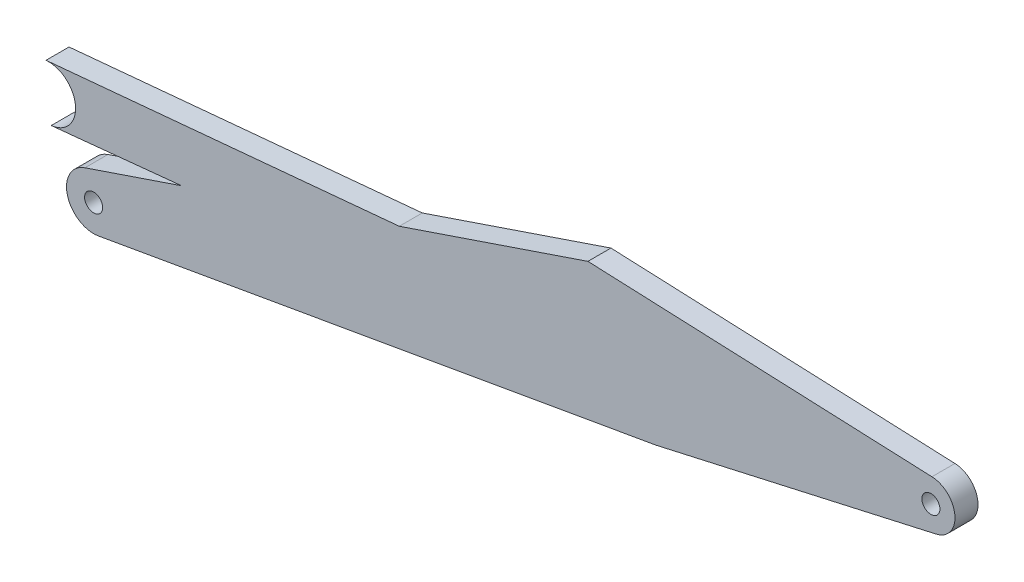
ISO-10303-21;
HEADER;
FILE_DESCRIPTION(('STEP AP214'),'2;1');
FILE_NAME('part.step','',(''),(''),'','','');
FILE_SCHEMA(('AUTOMOTIVE_DESIGN { 1 0 10303 214 1 1 1 1 }'));
ENDSEC;
DATA;
#1=APPLICATION_CONTEXT('core data for automotive mechanical design processes');
#2=APPLICATION_PROTOCOL_DEFINITION('international standard','automotive_design',2000,#1);
#3=PRODUCT_CONTEXT('',#1,'mechanical');
#4=PRODUCT('Part','Part','',(#3));
#5=PRODUCT_RELATED_PRODUCT_CATEGORY('part','',(#4));
#6=PRODUCT_DEFINITION_FORMATION('','',#4);
#7=PRODUCT_DEFINITION_CONTEXT('part definition',#1,'design');
#8=PRODUCT_DEFINITION('design','',#6,#7);
#9=PRODUCT_DEFINITION_SHAPE('','',#8);
#10=(LENGTH_UNIT() NAMED_UNIT(*) SI_UNIT(.MILLI.,.METRE.));
#11=(NAMED_UNIT(*) PLANE_ANGLE_UNIT() SI_UNIT($,.RADIAN.));
#12=(NAMED_UNIT(*) SI_UNIT($,.STERADIAN.) SOLID_ANGLE_UNIT());
#13=UNCERTAINTY_MEASURE_WITH_UNIT(LENGTH_MEASURE(1.E-05),#10,'distance_accuracy_value','');
#14=(GEOMETRIC_REPRESENTATION_CONTEXT(3) GLOBAL_UNCERTAINTY_ASSIGNED_CONTEXT((#13)) GLOBAL_UNIT_ASSIGNED_CONTEXT((#10,
#11,#12)) REPRESENTATION_CONTEXT('',''));
#15=CARTESIAN_POINT('',(0.,0.,0.));
#16=DIRECTION('',(0.,0.,1.));
#17=DIRECTION('',(1.,0.,0.));
#18=AXIS2_PLACEMENT_3D('',#15,#16,#17);
#19=CARTESIAN_POINT('',(-51.1200109094314,150.838496816133,6.35));
#20=DIRECTION('',(-0.320973485783683,0.94708818038442,0.));
#21=DIRECTION('',(-0.94708818038442,-0.320973485783683,0.));
#22=AXIS2_PLACEMENT_3D('',#19,#20,#21);
#23=PLANE('',#22);
#24=DIRECTION('',(0.94708818038442,0.320973485783683,0.));
#25=VECTOR('',#24,1.);
#26=CARTESIAN_POINT('',(-51.1200109094314,150.838496816133,0.));
#27=LINE('',#26,#25);
#28=CARTESIAN_POINT('',(-132.07794451347,123.401399944979,0.));
#29=VERTEX_POINT('',#28);
#30=CARTESIAN_POINT('',(-105.41946903293,132.436106509678,0.));
#31=VERTEX_POINT('',#30);
#32=EDGE_CURVE('E157',#29,#31,#27,.T.);
#33=ORIENTED_EDGE('',*,*,#32,.F.);
#34=DIRECTION('',(0.,0.,-1.));
#35=VECTOR('',#34,1.);
#36=CARTESIAN_POINT('',(-132.07794451347,123.401399944979,6.35));
#37=LINE('',#36,#35);
#38=CARTESIAN_POINT('',(-132.07794451347,123.401399944979,6.35));
#39=VERTEX_POINT('',#38);
#40=EDGE_CURVE('E11',#39,#29,#37,.T.);
#41=ORIENTED_EDGE('',*,*,#40,.F.);
#42=DIRECTION('',(0.94708818038442,0.320973485783683,0.));
#43=VECTOR('',#42,1.);
#44=CARTESIAN_POINT('',(-51.1200109094314,150.838496816133,6.35));
#45=LINE('',#44,#43);
#46=CARTESIAN_POINT('',(-105.41946903293,132.436106509678,6.35));
#47=VERTEX_POINT('',#46);
#48=EDGE_CURVE('E187',#39,#47,#45,.T.);
#49=ORIENTED_EDGE('',*,*,#48,.T.);
#50=DIRECTION('',(0.,0.,-1.));
#51=VECTOR('',#50,1.);
#52=CARTESIAN_POINT('',(-105.41946903293,132.436106509678,6.35));
#53=LINE('',#52,#51);
#54=EDGE_CURVE('E101',#47,#31,#53,.T.);
#55=ORIENTED_EDGE('',*,*,#54,.T.);
#56=EDGE_LOOP('',(#33,#41,#49,#55));
#57=FACE_BOUND('',#56,.T.);
#58=ADVANCED_FACE('F45',(#57),#23,.T.);
#59=CARTESIAN_POINT('',(-129.681042911032,116.32892424914,6.35));
#60=DIRECTION('',(0.,0.,-1.));
#61=DIRECTION('',(-1.,0.,0.));
#62=AXIS2_PLACEMENT_3D('',#59,#60,#61);
#63=CYLINDRICAL_SURFACE('',#62,7.4676);
#64=CARTESIAN_POINT('',(-129.681042911032,116.32892424914,0.));
#65=DIRECTION('',(0.,0.,1.));
#66=DIRECTION('',(1.,0.,0.));
#67=AXIS2_PLACEMENT_3D('',#64,#65,#66);
#68=CIRCLE('',#67,7.4676);
#69=CARTESIAN_POINT('',(-128.393349444225,108.973185313075,0.));
#70=VERTEX_POINT('',#69);
#71=EDGE_CURVE('E160',#29,#70,#68,.T.);
#72=ORIENTED_EDGE('',*,*,#71,.T.);
#73=DIRECTION('',(0.,0.,-1.));
#74=VECTOR('',#73,1.);
#75=CARTESIAN_POINT('',(-128.393349444225,108.973185313075,6.35));
#76=LINE('',#75,#74);
#77=CARTESIAN_POINT('',(-128.393349444225,108.973185313075,6.35));
#78=VERTEX_POINT('',#77);
#79=EDGE_CURVE('E53',#78,#70,#76,.T.);
#80=ORIENTED_EDGE('',*,*,#79,.F.);
#81=CARTESIAN_POINT('',(-129.681042911032,116.32892424914,6.35));
#82=DIRECTION('',(0.,0.,1.));
#83=DIRECTION('',(1.,0.,0.));
#84=AXIS2_PLACEMENT_3D('',#81,#82,#83);
#85=CIRCLE('',#84,7.4676);
#86=EDGE_CURVE('E225',#39,#78,#85,.T.);
#87=ORIENTED_EDGE('',*,*,#86,.F.);
#88=ORIENTED_EDGE('',*,*,#40,.T.);
#89=EDGE_LOOP('',(#72,#80,#87,#88));
#90=FACE_BOUND('',#89,.T.);
#91=ADVANCED_FACE('F235',(#90),#63,.T.);
#92=CARTESIAN_POINT('',(-22.3273027427624,127.541075850596,6.35));
#93=DIRECTION('',(-0.172437391773292,0.985020479948729,0.));
#94=DIRECTION('',(-0.985020479948729,-0.172437391773292,0.));
#95=AXIS2_PLACEMENT_3D('',#92,#93,#94);
#96=PLANE('',#95);
#97=DIRECTION('',(0.985020479948729,0.172437391773292,0.));
#98=VECTOR('',#97,1.);
#99=CARTESIAN_POINT('',(-22.3273027427624,127.541075850596,0.));
#100=LINE('',#99,#98);
#101=CARTESIAN_POINT('',(25.5217350516949,135.917514152232,0.));
#102=VERTEX_POINT('',#101);
#103=EDGE_CURVE('E162',#70,#102,#100,.T.);
#104=ORIENTED_EDGE('',*,*,#103,.T.);
#105=DIRECTION('',(0.,0.,-1.));
#106=VECTOR('',#105,1.);
#107=CARTESIAN_POINT('',(25.5217350516949,135.917514152232,6.35));
#108=LINE('',#107,#106);
#109=CARTESIAN_POINT('',(25.5217350516949,135.917514152232,6.35));
#110=VERTEX_POINT('',#109);
#111=EDGE_CURVE('E198',#110,#102,#108,.T.);
#112=ORIENTED_EDGE('',*,*,#111,.F.);
#113=DIRECTION('',(0.985020479948729,0.172437391773292,0.));
#114=VECTOR('',#113,1.);
#115=CARTESIAN_POINT('',(-22.3273027427624,127.541075850596,6.35));
#116=LINE('',#115,#114);
#117=EDGE_CURVE('E206',#78,#110,#116,.T.);
#118=ORIENTED_EDGE('',*,*,#117,.F.);
#119=ORIENTED_EDGE('',*,*,#79,.T.);
#120=EDGE_LOOP('',(#104,#112,#118,#119));
#121=FACE_BOUND('',#120,.T.);
#122=ADVANCED_FACE('F204',(#121),#96,.F.);
#123=CARTESIAN_POINT('',(-27.8957955703113,123.889680090386,6.35));
#124=DIRECTION('',(0.219666723094275,-0.975574974445851,0.));
#125=DIRECTION('',(0.975574974445851,0.219666723094275,0.));
#126=AXIS2_PLACEMENT_3D('',#123,#124,#125);
#127=PLANE('',#126);
#128=DIRECTION('',(-0.975574974445851,-0.219666723094275,0.));
#129=VECTOR('',#128,1.);
#130=CARTESIAN_POINT('',(-27.8957955703113,123.889680090386,0.));
#131=LINE('',#130,#129);
#132=CARTESIAN_POINT('',(102.676887006842,153.290263396292,0.));
#133=VERTEX_POINT('',#132);
#134=EDGE_CURVE('E165',#133,#102,#131,.T.);
#135=ORIENTED_EDGE('',*,*,#134,.F.);
#136=DIRECTION('',(0.,0.,-1.));
#137=VECTOR('',#136,1.);
#138=CARTESIAN_POINT('',(102.676887006842,153.290263396292,6.35));
#139=LINE('',#138,#137);
#140=CARTESIAN_POINT('',(102.676887006842,153.290263396292,6.35));
#141=VERTEX_POINT('',#140);
#142=EDGE_CURVE('E196',#141,#133,#139,.T.);
#143=ORIENTED_EDGE('',*,*,#142,.F.);
#144=DIRECTION('',(-0.975574974445851,-0.219666723094275,0.));
#145=VECTOR('',#144,1.);
#146=CARTESIAN_POINT('',(-27.8957955703113,123.889680090386,6.35));
#147=LINE('',#146,#145);
#148=EDGE_CURVE('E220',#141,#110,#147,.T.);
#149=ORIENTED_EDGE('',*,*,#148,.T.);
#150=ORIENTED_EDGE('',*,*,#111,.T.);
#151=EDGE_LOOP('',(#135,#143,#149,#150));
#152=FACE_BOUND('',#151,.T.);
#153=ADVANCED_FACE('F216',(#152),#127,.T.);
#154=CARTESIAN_POINT('',(101.218768587839,159.766,6.35));
#155=DIRECTION('',(0.,0.,-1.));
#156=DIRECTION('',(-1.,0.,0.));
#157=AXIS2_PLACEMENT_3D('',#154,#155,#156);
#158=CYLINDRICAL_SURFACE('',#157,6.63786666666665);
#159=CARTESIAN_POINT('',(101.218768587839,159.766,0.));
#160=DIRECTION('',(0.,0.,1.));
#161=DIRECTION('',(1.,0.,0.));
#162=AXIS2_PLACEMENT_3D('',#159,#160,#161);
#163=CIRCLE('',#162,6.63786666666665);
#164=CARTESIAN_POINT('',(101.499276887097,166.397937045727,0.));
#165=VERTEX_POINT('',#164);
#166=EDGE_CURVE('E168',#133,#165,#163,.T.);
#167=ORIENTED_EDGE('',*,*,#166,.T.);
#168=DIRECTION('',(0.,0.,-1.));
#169=VECTOR('',#168,1.);
#170=CARTESIAN_POINT('',(101.499276887097,166.397937045727,6.35));
#171=LINE('',#170,#169);
#172=CARTESIAN_POINT('',(101.499276887097,166.397937045727,6.35));
#173=VERTEX_POINT('',#172);
#174=EDGE_CURVE('E193',#173,#165,#171,.T.);
#175=ORIENTED_EDGE('',*,*,#174,.F.);
#176=CARTESIAN_POINT('',(101.218768587839,159.766,6.35));
#177=DIRECTION('',(0.,0.,1.));
#178=DIRECTION('',(1.,0.,0.));
#179=AXIS2_PLACEMENT_3D('',#176,#177,#178);
#180=CIRCLE('',#179,6.63786666666665);
#181=EDGE_CURVE('E221',#141,#173,#180,.T.);
#182=ORIENTED_EDGE('',*,*,#181,.F.);
#183=ORIENTED_EDGE('',*,*,#142,.T.);
#184=EDGE_LOOP('',(#167,#175,#182,#183));
#185=FACE_BOUND('',#184,.T.);
#186=ADVANCED_FACE('F245',(#185),#158,.T.);
#187=CARTESIAN_POINT('',(7.20675418569532,170.38618889332,6.35));
#188=DIRECTION('',(-0.0422588029173437,-0.999106697793581,0.));
#189=DIRECTION('',(0.999106697793581,-0.0422588029173437,0.));
#190=AXIS2_PLACEMENT_3D('',#187,#188,#189);
#191=PLANE('',#190);
#192=DIRECTION('',(-0.999106697793581,0.0422588029173437,0.));
#193=VECTOR('',#192,1.);
#194=CARTESIAN_POINT('',(7.20675418569532,170.38618889332,0.));
#195=LINE('',#194,#193);
#196=CARTESIAN_POINT('',(6.63074724122809,170.410552020901,0.));
#197=VERTEX_POINT('',#196);
#198=EDGE_CURVE('E170',#165,#197,#195,.T.);
#199=ORIENTED_EDGE('',*,*,#198,.T.);
#200=DIRECTION('',(0.,0.,-1.));
#201=VECTOR('',#200,1.);
#202=CARTESIAN_POINT('',(6.63074724122809,170.410552020901,6.35));
#203=LINE('',#202,#201);
#204=CARTESIAN_POINT('',(6.63074724122809,170.410552020901,6.35));
#205=VERTEX_POINT('',#204);
#206=EDGE_CURVE('E191',#205,#197,#203,.T.);
#207=ORIENTED_EDGE('',*,*,#206,.F.);
#208=DIRECTION('',(-0.999106697793581,0.0422588029173437,0.));
#209=VECTOR('',#208,1.);
#210=CARTESIAN_POINT('',(7.20675418569532,170.38618889332,6.35));
#211=LINE('',#210,#209);
#212=EDGE_CURVE('E223',#173,#205,#211,.T.);
#213=ORIENTED_EDGE('',*,*,#212,.F.);
#214=ORIENTED_EDGE('',*,*,#174,.T.);
#215=EDGE_LOOP('',(#199,#207,#213,#214));
#216=FACE_BOUND('',#215,.T.);
#217=ADVANCED_FACE('F248',(#216),#191,.F.);
#218=CARTESIAN_POINT('',(-51.1200109094314,150.838496816133,6.35));
#219=DIRECTION('',(-0.320973485783683,0.94708818038442,0.));
#220=DIRECTION('',(-0.94708818038442,-0.320973485783683,0.));
#221=AXIS2_PLACEMENT_3D('',#218,#219,#220);
#222=PLANE('',#221);
#223=DIRECTION('',(0.94708818038442,0.320973485783683,0.));
#224=VECTOR('',#223,1.);
#225=CARTESIAN_POINT('',(-51.1200109094314,150.838496816133,0.));
#226=LINE('',#225,#224);
#227=CARTESIAN_POINT('',(-45.3931629655145,152.779357641115,0.));
#228=VERTEX_POINT('',#227);
#229=EDGE_CURVE('E173',#228,#197,#226,.T.);
#230=ORIENTED_EDGE('',*,*,#229,.F.);
#231=DIRECTION('',(0.,0.,-1.));
#232=VECTOR('',#231,1.);
#233=CARTESIAN_POINT('',(-45.3931629655145,152.779357641115,6.35));
#234=LINE('',#233,#232);
#235=CARTESIAN_POINT('',(-45.3931629655145,152.779357641115,6.35));
#236=VERTEX_POINT('',#235);
#237=EDGE_CURVE('E137',#236,#228,#234,.T.);
#238=ORIENTED_EDGE('',*,*,#237,.F.);
#239=DIRECTION('',(0.94708818038442,0.320973485783683,0.));
#240=VECTOR('',#239,1.);
#241=CARTESIAN_POINT('',(-51.1200109094314,150.838496816133,6.35));
#242=LINE('',#241,#240);
#243=EDGE_CURVE('E144',#236,#205,#242,.T.);
#244=ORIENTED_EDGE('',*,*,#243,.T.);
#245=ORIENTED_EDGE('',*,*,#206,.T.);
#246=EDGE_LOOP('',(#230,#238,#244,#245));
#247=FACE_BOUND('',#246,.T.);
#248=ADVANCED_FACE('F231',(#247),#222,.T.);
#249=CARTESIAN_POINT('',(-14.4955230944036,155.65669896527,6.35));
#250=DIRECTION('',(-0.0927237608336719,0.995691872105452,0.));
#251=DIRECTION('',(-0.995691872105452,-0.0927237608336719,0.));
#252=AXIS2_PLACEMENT_3D('',#249,#250,#251);
#253=PLANE('',#252);
#254=DIRECTION('',(0.995691872105452,0.0927237608336719,0.));
#255=VECTOR('',#254,1.);
#256=CARTESIAN_POINT('',(-14.4955230944036,155.65669896527,0.));
#257=LINE('',#256,#255);
#258=CARTESIAN_POINT('',(-142.81014739499,143.707405344994,0.));
#259=VERTEX_POINT('',#258);
#260=EDGE_CURVE('E132',#259,#228,#257,.T.);
#261=ORIENTED_EDGE('',*,*,#260,.F.);
#262=DIRECTION('',(0.,0.,-1.));
#263=VECTOR('',#262,1.);
#264=CARTESIAN_POINT('',(-142.81014739499,143.707405344994,6.35));
#265=LINE('',#264,#263);
#266=CARTESIAN_POINT('',(-142.81014739499,143.707405344994,6.35));
#267=VERTEX_POINT('',#266);
#268=EDGE_CURVE('E127',#267,#259,#265,.T.);
#269=ORIENTED_EDGE('',*,*,#268,.F.);
#270=DIRECTION('',(0.995691872105452,0.0927237608336719,0.));
#271=VECTOR('',#270,1.);
#272=CARTESIAN_POINT('',(-14.4955230944036,155.65669896527,6.35));
#273=LINE('',#272,#271);
#274=EDGE_CURVE('E130',#267,#236,#273,.T.);
#275=ORIENTED_EDGE('',*,*,#274,.T.);
#276=ORIENTED_EDGE('',*,*,#237,.T.);
#277=EDGE_LOOP('',(#261,#269,#275,#276));
#278=FACE_BOUND('',#277,.T.);
#279=ADVANCED_FACE('F129',(#278),#253,.T.);
#280=CARTESIAN_POINT('',(-142.117723438589,136.271976720859,6.35));
#281=DIRECTION('',(0.,0.,-1.));
#282=DIRECTION('',(-1.,0.,0.));
#283=AXIS2_PLACEMENT_3D('',#280,#281,#282);
#284=CYLINDRICAL_SURFACE('',#283,7.46759999999998);
#285=CARTESIAN_POINT('',(-142.117723438589,136.271976720859,0.));
#286=DIRECTION('',(0.,0.,1.));
#287=DIRECTION('',(1.,0.,0.));
#288=AXIS2_PLACEMENT_3D('',#285,#286,#287);
#289=CIRCLE('',#288,7.46759999999998);
#290=CARTESIAN_POINT('',(-141.374843498332,128.841419598115,0.));
#291=VERTEX_POINT('',#290);
#292=EDGE_CURVE('E177',#291,#259,#289,.T.);
#293=ORIENTED_EDGE('',*,*,#292,.F.);
#294=DIRECTION('',(0.,0.,-1.));
#295=VECTOR('',#294,1.);
#296=CARTESIAN_POINT('',(-141.374843498332,128.841419598115,6.35));
#297=LINE('',#296,#295);
#298=CARTESIAN_POINT('',(-141.374843498332,128.841419598115,6.35));
#299=VERTEX_POINT('',#298);
#300=EDGE_CURVE('E94',#299,#291,#297,.T.);
#301=ORIENTED_EDGE('',*,*,#300,.F.);
#302=CARTESIAN_POINT('',(-142.117723438589,136.271976720859,6.35));
#303=DIRECTION('',(0.,0.,1.));
#304=DIRECTION('',(1.,0.,0.));
#305=AXIS2_PLACEMENT_3D('',#302,#303,#304);
#306=CIRCLE('',#305,7.46759999999998);
#307=EDGE_CURVE('E142',#299,#267,#306,.T.);
#308=ORIENTED_EDGE('',*,*,#307,.T.);
#309=ORIENTED_EDGE('',*,*,#268,.T.);
#310=EDGE_LOOP('',(#293,#301,#308,#309));
#311=FACE_BOUND('',#310,.T.);
#312=ADVANCED_FACE('F146',(#311),#284,.F.);
#313=CARTESIAN_POINT('',(101.218768587839,159.766,6.35));
#314=DIRECTION('',(0.,0.,-1.));
#315=DIRECTION('',(-1.,0.,0.));
#316=AXIS2_PLACEMENT_3D('',#313,#314,#315);
#317=CYLINDRICAL_SURFACE('',#316,2.48920000000001);
#318=CARTESIAN_POINT('',(101.218768587839,159.766,6.35));
#319=DIRECTION('',(0.,0.,1.));
#320=DIRECTION('',(1.,0.,0.));
#321=AXIS2_PLACEMENT_3D('',#318,#319,#320);
#322=CIRCLE('',#321,2.48920000000001);
#323=CARTESIAN_POINT('',(103.707968587839,159.766,6.35));
#324=VERTEX_POINT('',#323);
#325=EDGE_CURVE('E148',#324,#324,#322,.T.);
#326=ORIENTED_EDGE('',*,*,#325,.T.);
#327=EDGE_LOOP('',(#326));
#328=FACE_BOUND('',#327,.T.);
#329=CARTESIAN_POINT('',(101.218768587839,159.766,0.));
#330=DIRECTION('',(0.,0.,1.));
#331=DIRECTION('',(1.,0.,0.));
#332=AXIS2_PLACEMENT_3D('',#329,#330,#331);
#333=CIRCLE('',#332,2.48920000000001);
#334=CARTESIAN_POINT('',(103.707968587839,159.766,0.));
#335=VERTEX_POINT('',#334);
#336=EDGE_CURVE('E181',#335,#335,#333,.T.);
#337=ORIENTED_EDGE('',*,*,#336,.F.);
#338=EDGE_LOOP('',(#337));
#339=FACE_BOUND('',#338,.T.);
#340=ADVANCED_FACE('F259',(#328,#339),#317,.F.);
#341=CARTESIAN_POINT('',(-14.1527136523222,141.560623105747,6.35));
#342=DIRECTION('',(-0.0994804140896887,0.995039520427477,0.));
#343=DIRECTION('',(-0.995039520427477,-0.0994804140896888,0.));
#344=AXIS2_PLACEMENT_3D('',#341,#342,#343);
#345=PLANE('',#344);
#346=DIRECTION('',(0.995039520427477,0.0994804140896887,0.));
#347=VECTOR('',#346,1.);
#348=CARTESIAN_POINT('',(-14.1527136523222,141.560623105747,0.));
#349=LINE('',#348,#347);
#350=EDGE_CURVE('E179',#291,#31,#349,.T.);
#351=ORIENTED_EDGE('',*,*,#350,.T.);
#352=ORIENTED_EDGE('',*,*,#54,.F.);
#353=DIRECTION('',(0.995039520427477,0.0994804140896887,0.));
#354=VECTOR('',#353,1.);
#355=CARTESIAN_POINT('',(-14.1527136523222,141.560623105747,6.35));
#356=LINE('',#355,#354);
#357=EDGE_CURVE('E61',#299,#47,#356,.T.);
#358=ORIENTED_EDGE('',*,*,#357,.F.);
#359=ORIENTED_EDGE('',*,*,#300,.T.);
#360=EDGE_LOOP('',(#351,#352,#358,#359));
#361=FACE_BOUND('',#360,.T.);
#362=ADVANCED_FACE('F233',(#361),#345,.F.);
#363=CARTESIAN_POINT('',(-129.681042911032,116.32892424914,6.35));
#364=DIRECTION('',(0.,0.,-1.));
#365=DIRECTION('',(-1.,0.,0.));
#366=AXIS2_PLACEMENT_3D('',#363,#364,#365);
#367=CYLINDRICAL_SURFACE('',#366,2.4892);
#368=CARTESIAN_POINT('',(-129.681042911032,116.32892424914,6.35));
#369=DIRECTION('',(0.,0.,1.));
#370=DIRECTION('',(1.,0.,0.));
#371=AXIS2_PLACEMENT_3D('',#368,#369,#370);
#372=CIRCLE('',#371,2.4892);
#373=CARTESIAN_POINT('',(-127.191842911032,116.32892424914,6.35));
#374=VERTEX_POINT('',#373);
#375=EDGE_CURVE('E154',#374,#374,#372,.T.);
#376=ORIENTED_EDGE('',*,*,#375,.T.);
#377=EDGE_LOOP('',(#376));
#378=FACE_BOUND('',#377,.T.);
#379=CARTESIAN_POINT('',(-129.681042911032,116.32892424914,0.));
#380=DIRECTION('',(0.,0.,1.));
#381=DIRECTION('',(1.,0.,0.));
#382=AXIS2_PLACEMENT_3D('',#379,#380,#381);
#383=CIRCLE('',#382,2.4892);
#384=CARTESIAN_POINT('',(-127.191842911032,116.32892424914,0.));
#385=VERTEX_POINT('',#384);
#386=EDGE_CURVE('E184',#385,#385,#383,.T.);
#387=ORIENTED_EDGE('',*,*,#386,.F.);
#388=EDGE_LOOP('',(#387));
#389=FACE_BOUND('',#388,.T.);
#390=ADVANCED_FACE('F262',(#378,#389),#367,.F.);
#391=CARTESIAN_POINT('',(0.,0.,6.35));
#392=DIRECTION('',(0.,0.,1.));
#393=DIRECTION('',(1.,0.,0.));
#394=AXIS2_PLACEMENT_3D('',#391,#392,#393);
#395=PLANE('',#394);
#396=ORIENTED_EDGE('',*,*,#48,.F.);
#397=ORIENTED_EDGE('',*,*,#86,.T.);
#398=ORIENTED_EDGE('',*,*,#117,.T.);
#399=ORIENTED_EDGE('',*,*,#148,.F.);
#400=ORIENTED_EDGE('',*,*,#181,.T.);
#401=ORIENTED_EDGE('',*,*,#212,.T.);
#402=ORIENTED_EDGE('',*,*,#243,.F.);
#403=ORIENTED_EDGE('',*,*,#274,.F.);
#404=ORIENTED_EDGE('',*,*,#307,.F.);
#405=ORIENTED_EDGE('',*,*,#357,.T.);
#406=EDGE_LOOP('',(#396,#397,#398,#399,#400,#401,#402,#403,#404,#405));
#407=FACE_BOUND('',#406,.T.);
#408=ORIENTED_EDGE('',*,*,#325,.F.);
#409=EDGE_LOOP('',(#408));
#410=FACE_BOUND('',#409,.T.);
#411=ORIENTED_EDGE('',*,*,#375,.F.);
#412=EDGE_LOOP('',(#411));
#413=FACE_BOUND('',#412,.T.);
#414=ADVANCED_FACE('F140',(#407,#410,#413),#395,.T.);
#415=CARTESIAN_POINT('',(0.,0.,0.));
#416=DIRECTION('',(0.,0.,1.));
#417=DIRECTION('',(1.,0.,0.));
#418=AXIS2_PLACEMENT_3D('',#415,#416,#417);
#419=PLANE('',#418);
#420=ORIENTED_EDGE('',*,*,#32,.T.);
#421=ORIENTED_EDGE('',*,*,#350,.F.);
#422=ORIENTED_EDGE('',*,*,#292,.T.);
#423=ORIENTED_EDGE('',*,*,#260,.T.);
#424=ORIENTED_EDGE('',*,*,#229,.T.);
#425=ORIENTED_EDGE('',*,*,#198,.F.);
#426=ORIENTED_EDGE('',*,*,#166,.F.);
#427=ORIENTED_EDGE('',*,*,#134,.T.);
#428=ORIENTED_EDGE('',*,*,#103,.F.);
#429=ORIENTED_EDGE('',*,*,#71,.F.);
#430=EDGE_LOOP('',(#420,#421,#422,#423,#424,#425,#426,#427,#428,#429));
#431=FACE_BOUND('',#430,.T.);
#432=ORIENTED_EDGE('',*,*,#336,.T.);
#433=EDGE_LOOP('',(#432));
#434=FACE_BOUND('',#433,.T.);
#435=ORIENTED_EDGE('',*,*,#386,.T.);
#436=EDGE_LOOP('',(#435));
#437=FACE_BOUND('',#436,.T.);
#438=ADVANCED_FACE('F210',(#431,#434,#437),#419,.F.);
#439=CLOSED_SHELL('',(#58,#91,#122,#153,#186,#217,#248,#279,#312,#340,#362,#390,#414,#438));
#440=MANIFOLD_SOLID_BREP('B2',#439);
#441=ADVANCED_BREP_SHAPE_REPRESENTATION('',(#18,#440),#14);
#442=SHAPE_DEFINITION_REPRESENTATION(#9,#441);
ENDSEC;
END-ISO-10303-21;
